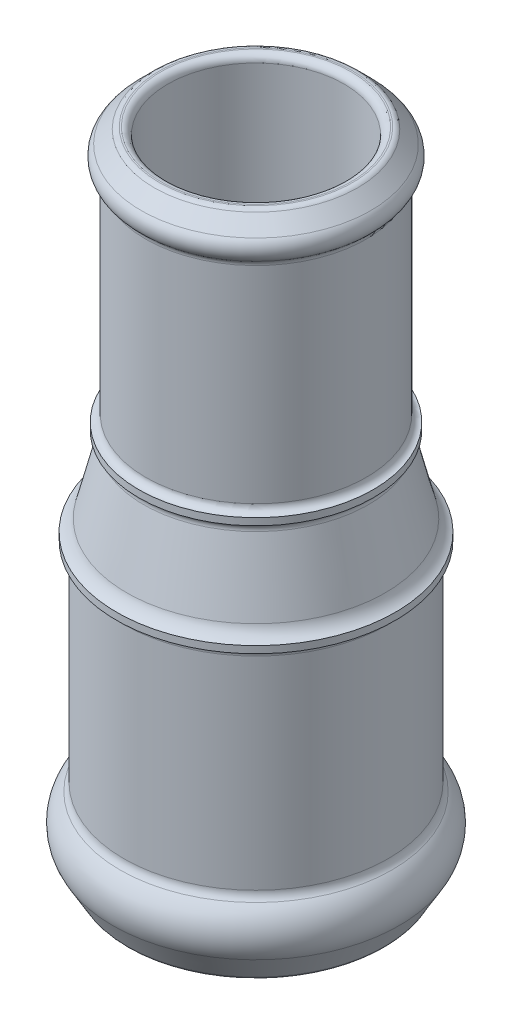
ISO-10303-21;
HEADER;
FILE_DESCRIPTION(('STEP AP214'),'2;1');
FILE_NAME('part.step','',(''),(''),'','','');
FILE_SCHEMA(('AUTOMOTIVE_DESIGN { 1 0 10303 214 1 1 1 1 }'));
ENDSEC;
DATA;
#1=APPLICATION_CONTEXT('core data for automotive mechanical design processes');
#2=APPLICATION_PROTOCOL_DEFINITION('international standard','automotive_design',2000,#1);
#3=PRODUCT_CONTEXT('',#1,'mechanical');
#4=PRODUCT('Part','Part','',(#3));
#5=PRODUCT_RELATED_PRODUCT_CATEGORY('part','',(#4));
#6=PRODUCT_DEFINITION_FORMATION('','',#4);
#7=PRODUCT_DEFINITION_CONTEXT('part definition',#1,'design');
#8=PRODUCT_DEFINITION('design','',#6,#7);
#9=PRODUCT_DEFINITION_SHAPE('','',#8);
#10=(LENGTH_UNIT() NAMED_UNIT(*) SI_UNIT(.MILLI.,.METRE.));
#11=(NAMED_UNIT(*) PLANE_ANGLE_UNIT() SI_UNIT($,.RADIAN.));
#12=(NAMED_UNIT(*) SI_UNIT($,.STERADIAN.) SOLID_ANGLE_UNIT());
#13=UNCERTAINTY_MEASURE_WITH_UNIT(LENGTH_MEASURE(1.E-05),#10,'distance_accuracy_value','');
#14=(GEOMETRIC_REPRESENTATION_CONTEXT(3) GLOBAL_UNCERTAINTY_ASSIGNED_CONTEXT((#13)) GLOBAL_UNIT_ASSIGNED_CONTEXT((#10,
#11,#12)) REPRESENTATION_CONTEXT('',''));
#15=CARTESIAN_POINT('',(0.,0.,0.));
#16=DIRECTION('',(0.,0.,1.));
#17=DIRECTION('',(1.,0.,0.));
#18=AXIS2_PLACEMENT_3D('',#15,#16,#17);
#19=CARTESIAN_POINT('',(0.,0.,0.));
#20=DIRECTION('',(0.,-1.,0.));
#21=DIRECTION('',(0.,0.,-1.));
#22=AXIS2_PLACEMENT_3D('',#19,#20,#21);
#23=CYLINDRICAL_SURFACE('',#22,8.4455);
#24=CARTESIAN_POINT('',(0.,28.321,0.));
#25=DIRECTION('',(0.,-1.,0.));
#26=DIRECTION('',(0.,0.,-1.));
#27=AXIS2_PLACEMENT_3D('',#24,#25,#26);
#28=CIRCLE('',#27,8.4455);
#29=CARTESIAN_POINT('',(0.,28.321,-8.4455));
#30=VERTEX_POINT('',#29);
#31=EDGE_CURVE('E137',#30,#30,#28,.T.);
#32=ORIENTED_EDGE('',*,*,#31,.T.);
#33=EDGE_LOOP('',(#32));
#34=FACE_BOUND('',#33,.T.);
#35=CARTESIAN_POINT('',(0.,27.813,0.));
#36=DIRECTION('',(0.,-1.,0.));
#37=DIRECTION('',(0.,0.,-1.));
#38=AXIS2_PLACEMENT_3D('',#35,#36,#37);
#39=CIRCLE('',#38,8.4455);
#40=CARTESIAN_POINT('',(0.,27.813,-8.4455));
#41=VERTEX_POINT('',#40);
#42=EDGE_CURVE('E141',#41,#41,#39,.T.);
#43=ORIENTED_EDGE('',*,*,#42,.F.);
#44=EDGE_LOOP('',(#43));
#45=FACE_BOUND('',#44,.T.);
#46=ADVANCED_FACE('F41',(#34,#45),#23,.T.);
#47=CARTESIAN_POINT('',(0.,21.463,0.));
#48=DIRECTION('',(0.,-1.,0.));
#49=DIRECTION('',(0.,0.,-1.));
#50=AXIS2_PLACEMENT_3D('',#47,#48,#49);
#51=CONICAL_SURFACE('',#50,9.525,0.244978663126864);
#52=CARTESIAN_POINT('',(0.,22.317925733049,0.));
#53=DIRECTION('',(0.,-1.,0.));
#54=DIRECTION('',(0.,0.,-1.));
#55=AXIS2_PLACEMENT_3D('',#52,#53,#54);
#56=CIRCLE('',#55,9.31126856673774);
#57=CARTESIAN_POINT('',(0.,22.317925733049,-9.31126856673774));
#58=VERTEX_POINT('',#57);
#59=EDGE_CURVE('E81',#58,#58,#56,.F.);
#60=ORIENTED_EDGE('',*,*,#59,.T.);
#61=EDGE_LOOP('',(#60));
#62=FACE_BOUND('',#61,.T.);
#63=CARTESIAN_POINT('',(0.,27.2008579198598,0.));
#64=DIRECTION('',(0.,-1.,0.));
#65=DIRECTION('',(0.,0.,-1.));
#66=AXIS2_PLACEMENT_3D('',#63,#64,#65);
#67=CIRCLE('',#66,8.09053552003505);
#68=CARTESIAN_POINT('',(0.,27.2008579198598,-8.09053552003505));
#69=VERTEX_POINT('',#68);
#70=EDGE_CURVE('E93',#69,#69,#67,.T.);
#71=ORIENTED_EDGE('',*,*,#70,.T.);
#72=EDGE_LOOP('',(#71));
#73=FACE_BOUND('',#72,.T.);
#74=ADVANCED_FACE('F161',(#62,#73),#51,.T.);
#75=CARTESIAN_POINT('',(0.,0.,0.));
#76=DIRECTION('',(0.,-1.,0.));
#77=DIRECTION('',(0.,0.,-1.));
#78=AXIS2_PLACEMENT_3D('',#75,#76,#77);
#79=CYLINDRICAL_SURFACE('',#78,10.033);
#80=CARTESIAN_POINT('',(0.,20.955,0.));
#81=DIRECTION('',(0.,-1.,0.));
#82=DIRECTION('',(0.,0.,-1.));
#83=AXIS2_PLACEMENT_3D('',#80,#81,#82);
#84=CIRCLE('',#83,10.033);
#85=CARTESIAN_POINT('',(0.,20.955,-10.033));
#86=VERTEX_POINT('',#85);
#87=EDGE_CURVE('E149',#86,#86,#84,.T.);
#88=ORIENTED_EDGE('',*,*,#87,.F.);
#89=EDGE_LOOP('',(#88));
#90=FACE_BOUND('',#89,.T.);
#91=CARTESIAN_POINT('',(0.,21.463,0.));
#92=DIRECTION('',(0.,-1.,0.));
#93=DIRECTION('',(0.,0.,-1.));
#94=AXIS2_PLACEMENT_3D('',#91,#92,#93);
#95=CIRCLE('',#94,10.033);
#96=CARTESIAN_POINT('',(0.,21.463,-10.033));
#97=VERTEX_POINT('',#96);
#98=EDGE_CURVE('E145',#97,#97,#95,.T.);
#99=ORIENTED_EDGE('',*,*,#98,.T.);
#100=EDGE_LOOP('',(#99));
#101=FACE_BOUND('',#100,.T.);
#102=ADVANCED_FACE('F157',(#90,#101),#79,.T.);
#103=CARTESIAN_POINT('',(0.,0.,0.));
#104=DIRECTION('',(0.,-1.,0.));
#105=DIRECTION('',(0.,0.,-1.));
#106=AXIS2_PLACEMENT_3D('',#103,#104,#105);
#107=CYLINDRICAL_SURFACE('',#106,9.525);
#108=CARTESIAN_POINT('',(0.,20.447,0.));
#109=DIRECTION('',(0.,1.,0.));
#110=DIRECTION('',(0.,0.,1.));
#111=AXIS2_PLACEMENT_3D('',#108,#109,#110);
#112=CIRCLE('',#111,9.525);
#113=CARTESIAN_POINT('',(0.,20.447,9.525));
#114=VERTEX_POINT('',#113);
#115=EDGE_CURVE('E85',#114,#114,#112,.F.);
#116=ORIENTED_EDGE('',*,*,#115,.T.);
#117=EDGE_LOOP('',(#116));
#118=FACE_BOUND('',#117,.T.);
#119=CARTESIAN_POINT('',(0.,5.842,0.));
#120=DIRECTION('',(0.,-1.,0.));
#121=DIRECTION('',(0.,0.,-1.));
#122=AXIS2_PLACEMENT_3D('',#119,#120,#121);
#123=CIRCLE('',#122,9.525);
#124=CARTESIAN_POINT('',(0.,5.842,-9.525));
#125=VERTEX_POINT('',#124);
#126=EDGE_CURVE('E117',#125,#125,#123,.F.);
#127=ORIENTED_EDGE('',*,*,#126,.T.);
#128=EDGE_LOOP('',(#127));
#129=FACE_BOUND('',#128,.T.);
#130=ADVANCED_FACE('F160',(#118,#129),#107,.T.);
#131=CARTESIAN_POINT('',(0.,0.,0.));
#132=DIRECTION('',(0.,1.,0.));
#133=DIRECTION('',(0.,0.,1.));
#134=AXIS2_PLACEMENT_3D('',#131,#132,#133);
#135=PLANE('',#134);
#136=CARTESIAN_POINT('',(0.,0.,0.));
#137=DIRECTION('',(0.,1.,0.));
#138=DIRECTION('',(0.,0.,1.));
#139=AXIS2_PLACEMENT_3D('',#136,#137,#138);
#140=CIRCLE('',#139,8.83876669576836);
#141=CARTESIAN_POINT('',(0.,0.,8.83876669576836));
#142=VERTEX_POINT('',#141);
#143=EDGE_CURVE('E73',#142,#142,#140,.F.);
#144=ORIENTED_EDGE('',*,*,#143,.T.);
#145=EDGE_LOOP('',(#144));
#146=FACE_BOUND('',#145,.T.);
#147=CARTESIAN_POINT('',(0.,0.,0.));
#148=DIRECTION('',(0.,1.,0.));
#149=DIRECTION('',(0.,0.,1.));
#150=AXIS2_PLACEMENT_3D('',#147,#148,#149);
#151=CIRCLE('',#150,8.4455);
#152=CARTESIAN_POINT('',(0.,0.,8.4455));
#153=VERTEX_POINT('',#152);
#154=EDGE_CURVE('E77',#153,#153,#151,.T.);
#155=ORIENTED_EDGE('',*,*,#154,.T.);
#156=EDGE_LOOP('',(#155));
#157=FACE_BOUND('',#156,.T.);
#158=ADVANCED_FACE('F262',(#146,#157),#135,.F.);
#159=CARTESIAN_POINT('',(0.,0.,0.));
#160=DIRECTION('',(0.,-1.,0.));
#161=DIRECTION('',(0.,0.,-1.));
#162=AXIS2_PLACEMENT_3D('',#159,#160,#161);
#163=CYLINDRICAL_SURFACE('',#162,7.9375);
#164=CARTESIAN_POINT('',(0.,0.507999999999999,0.));
#165=DIRECTION('',(0.,1.,0.));
#166=DIRECTION('',(0.,0.,1.));
#167=AXIS2_PLACEMENT_3D('',#164,#165,#166);
#168=CIRCLE('',#167,7.9375);
#169=CARTESIAN_POINT('',(0.,0.507999999999999,7.9375));
#170=VERTEX_POINT('',#169);
#171=EDGE_CURVE('E65',#170,#170,#168,.F.);
#172=ORIENTED_EDGE('',*,*,#171,.T.);
#173=EDGE_LOOP('',(#172));
#174=FACE_BOUND('',#173,.T.);
#175=CARTESIAN_POINT('',(0.,20.8376234218623,0.));
#176=DIRECTION('',(0.,-1.,0.));
#177=DIRECTION('',(0.,0.,-1.));
#178=AXIS2_PLACEMENT_3D('',#175,#176,#177);
#179=CIRCLE('',#178,7.9375);
#180=CARTESIAN_POINT('',(0.,20.8376234218623,-7.9375));
#181=VERTEX_POINT('',#180);
#182=EDGE_CURVE('E125',#181,#181,#179,.F.);
#183=ORIENTED_EDGE('',*,*,#182,.T.);
#184=EDGE_LOOP('',(#183));
#185=FACE_BOUND('',#184,.T.);
#186=ADVANCED_FACE('F258',(#174,#185),#163,.F.);
#187=CARTESIAN_POINT('',(0.,21.463,0.));
#188=DIRECTION('',(0.,-1.,0.));
#189=DIRECTION('',(0.,0.,-1.));
#190=AXIS2_PLACEMENT_3D('',#187,#188,#189);
#191=CONICAL_SURFACE('',#190,7.9375,0.244978663126864);
#192=CARTESIAN_POINT('',(0.,22.0697043970468,0.));
#193=DIRECTION('',(0.,-1.,0.));
#194=DIRECTION('',(0.,0.,-1.));
#195=AXIS2_PLACEMENT_3D('',#192,#193,#194);
#196=CIRCLE('',#195,7.78582390073829);
#197=CARTESIAN_POINT('',(0.,22.0697043970468,-7.78582390073829));
#198=VERTEX_POINT('',#197);
#199=EDGE_CURVE('E129',#198,#198,#196,.T.);
#200=ORIENTED_EDGE('',*,*,#199,.T.);
#201=EDGE_LOOP('',(#200));
#202=FACE_BOUND('',#201,.T.);
#203=CARTESIAN_POINT('',(0.,27.2062956029531,0.));
#204=DIRECTION('',(0.,1.,0.));
#205=DIRECTION('',(0.,0.,1.));
#206=AXIS2_PLACEMENT_3D('',#203,#204,#205);
#207=CIRCLE('',#206,6.50167609926172);
#208=CARTESIAN_POINT('',(0.,27.2062956029531,6.50167609926172));
#209=VERTEX_POINT('',#208);
#210=EDGE_CURVE('E133',#209,#209,#207,.T.);
#211=ORIENTED_EDGE('',*,*,#210,.T.);
#212=EDGE_LOOP('',(#211));
#213=FACE_BOUND('',#212,.T.);
#214=ADVANCED_FACE('F255',(#202,#213),#191,.F.);
#215=CARTESIAN_POINT('',(0.,0.,0.));
#216=DIRECTION('',(0.,-1.,0.));
#217=DIRECTION('',(0.,0.,-1.));
#218=AXIS2_PLACEMENT_3D('',#215,#216,#217);
#219=CYLINDRICAL_SURFACE('',#218,6.35);
#220=CARTESIAN_POINT('',(0.,46.228,0.));
#221=DIRECTION('',(0.,1.,0.));
#222=DIRECTION('',(0.,0.,1.));
#223=AXIS2_PLACEMENT_3D('',#220,#221,#222);
#224=CIRCLE('',#223,6.35);
#225=CARTESIAN_POINT('',(0.,46.228,6.35));
#226=VERTEX_POINT('',#225);
#227=EDGE_CURVE('E10',#226,#226,#224,.T.);
#228=ORIENTED_EDGE('',*,*,#227,.T.);
#229=EDGE_LOOP('',(#228));
#230=FACE_BOUND('',#229,.T.);
#231=CARTESIAN_POINT('',(0.,28.4383765781377,0.));
#232=DIRECTION('',(0.,1.,0.));
#233=DIRECTION('',(0.,0.,1.));
#234=AXIS2_PLACEMENT_3D('',#231,#232,#233);
#235=CIRCLE('',#234,6.35);
#236=CARTESIAN_POINT('',(0.,28.4383765781377,6.35));
#237=VERTEX_POINT('',#236);
#238=EDGE_CURVE('E121',#237,#237,#235,.F.);
#239=ORIENTED_EDGE('',*,*,#238,.T.);
#240=EDGE_LOOP('',(#239));
#241=FACE_BOUND('',#240,.T.);
#242=ADVANCED_FACE('F249',(#230,#241),#219,.F.);
#243=CARTESIAN_POINT('',(0.,46.736,0.));
#244=DIRECTION('',(0.,1.,0.));
#245=DIRECTION('',(0.,0.,1.));
#246=AXIS2_PLACEMENT_3D('',#243,#244,#245);
#247=PLANE('',#246);
#248=CARTESIAN_POINT('',(0.,46.736,0.));
#249=DIRECTION('',(0.,1.,0.));
#250=DIRECTION('',(0.,0.,1.));
#251=AXIS2_PLACEMENT_3D('',#248,#249,#250);
#252=CIRCLE('',#251,6.96507951031445);
#253=CARTESIAN_POINT('',(0.,46.736,6.96507951031445));
#254=VERTEX_POINT('',#253);
#255=EDGE_CURVE('E54',#254,#254,#252,.T.);
#256=ORIENTED_EDGE('',*,*,#255,.T.);
#257=EDGE_LOOP('',(#256));
#258=FACE_BOUND('',#257,.T.);
#259=CARTESIAN_POINT('',(0.,46.736,0.));
#260=DIRECTION('',(0.,1.,0.));
#261=DIRECTION('',(0.,0.,1.));
#262=AXIS2_PLACEMENT_3D('',#259,#260,#261);
#263=CIRCLE('',#262,6.858);
#264=CARTESIAN_POINT('',(0.,46.736,6.858));
#265=VERTEX_POINT('',#264);
#266=EDGE_CURVE('E59',#265,#265,#263,.F.);
#267=ORIENTED_EDGE('',*,*,#266,.T.);
#268=EDGE_LOOP('',(#267));
#269=FACE_BOUND('',#268,.T.);
#270=ADVANCED_FACE('F242',(#258,#269),#247,.T.);
#271=CARTESIAN_POINT('',(0.,0.,0.));
#272=DIRECTION('',(0.,-1.,0.));
#273=DIRECTION('',(0.,0.,-1.));
#274=AXIS2_PLACEMENT_3D('',#271,#272,#273);
#275=CYLINDRICAL_SURFACE('',#274,7.9375);
#276=CARTESIAN_POINT('',(0.,28.829,0.));
#277=DIRECTION('',(0.,1.,0.));
#278=DIRECTION('',(0.,0.,1.));
#279=AXIS2_PLACEMENT_3D('',#276,#277,#278);
#280=CIRCLE('',#279,7.9375);
#281=CARTESIAN_POINT('',(0.,28.829,7.9375));
#282=VERTEX_POINT('',#281);
#283=EDGE_CURVE('E89',#282,#282,#280,.T.);
#284=ORIENTED_EDGE('',*,*,#283,.T.);
#285=EDGE_LOOP('',(#284));
#286=FACE_BOUND('',#285,.T.);
#287=CARTESIAN_POINT('',(0.,43.688,0.));
#288=DIRECTION('',(0.,-1.,0.));
#289=DIRECTION('',(0.,0.,-1.));
#290=AXIS2_PLACEMENT_3D('',#287,#288,#289);
#291=CIRCLE('',#290,7.9375);
#292=CARTESIAN_POINT('',(0.,43.688,-7.9375));
#293=VERTEX_POINT('',#292);
#294=EDGE_CURVE('E105',#293,#293,#291,.T.);
#295=ORIENTED_EDGE('',*,*,#294,.T.);
#296=EDGE_LOOP('',(#295));
#297=FACE_BOUND('',#296,.T.);
#298=ADVANCED_FACE('F194',(#286,#297),#275,.T.);
#299=CARTESIAN_POINT('',(0.,20.8376234218623,0.));
#300=DIRECTION('',(0.,-1.,0.));
#301=DIRECTION('',(0.,0.,-1.));
#302=AXIS2_PLACEMENT_3D('',#299,#300,#301);
#303=DEGENERATE_TOROIDAL_SURFACE('',#302,2.8575,5.08,.T.);
#304=ORIENTED_EDGE('',*,*,#182,.F.);
#305=EDGE_LOOP('',(#304));
#306=FACE_BOUND('',#305,.T.);
#307=ORIENTED_EDGE('',*,*,#199,.F.);
#308=EDGE_LOOP('',(#307));
#309=FACE_BOUND('',#308,.T.);
#310=ADVANCED_FACE('F190',(#306,#309),#303,.F.);
#311=CARTESIAN_POINT('',(0.,28.4383765781377,0.));
#312=DIRECTION('',(0.,1.,0.));
#313=DIRECTION('',(0.,0.,1.));
#314=AXIS2_PLACEMENT_3D('',#311,#312,#313);
#315=TOROIDAL_SURFACE('',#314,11.43,5.08);
#316=ORIENTED_EDGE('',*,*,#210,.F.);
#317=EDGE_LOOP('',(#316));
#318=FACE_BOUND('',#317,.T.);
#319=ORIENTED_EDGE('',*,*,#238,.F.);
#320=EDGE_LOOP('',(#319));
#321=FACE_BOUND('',#320,.T.);
#322=ADVANCED_FACE('F193',(#318,#321),#315,.T.);
#323=CARTESIAN_POINT('',(0.,0.,0.));
#324=DIRECTION('',(0.,1.,0.));
#325=DIRECTION('',(0.,0.,1.));
#326=AXIS2_PLACEMENT_3D('',#323,#324,#325);
#327=CONICAL_SURFACE('',#326,9.13206063251669,0.523598775598296);
#328=CARTESIAN_POINT('',(0.,0.254,0.));
#329=DIRECTION('',(0.,1.,0.));
#330=DIRECTION('',(0.,0.,1.));
#331=AXIS2_PLACEMENT_3D('',#328,#329,#330);
#332=CIRCLE('',#331,9.27870760089085);
#333=CARTESIAN_POINT('',(0.,0.254,9.27870760089085));
#334=VERTEX_POINT('',#333);
#335=EDGE_CURVE('E69',#334,#334,#332,.T.);
#336=CARTESIAN_POINT('',(0.,2.07271748486344,0.));
#337=DIRECTION('',(0.,1.,0.));
#338=DIRECTION('',(0.,0.,1.));
#339=AXIS2_PLACEMENT_3D('',#336,#337,#338);
#340=CIRCLE('',#339,10.3287446303566);
#341=CARTESIAN_POINT('',(0.,2.07271748486344,10.3287446303566));
#342=VERTEX_POINT('',#341);
#343=EDGE_CURVE('E113',#342,#342,#340,.F.);
#344=CARTESIAN_POINT('',(0.,0.254,9.27870760089085));
#345=CARTESIAN_POINT('',(0.,0.272944973800661,9.28964548661445));
#346=CARTESIAN_POINT('',(0.,0.291889947601322,9.30058337233806));
#347=CARTESIAN_POINT('',(0.,0.329779895202643,9.32245914378526));
#348=CARTESIAN_POINT('',(0.,0.348724869003304,9.33339702950886));
#349=CARTESIAN_POINT('',(0.,0.386614816604625,9.35527280095607));
#350=CARTESIAN_POINT('',(0.,0.405559790405286,9.36621068667967));
#351=CARTESIAN_POINT('',(0.,0.443449738006608,9.38808645812687));
#352=CARTESIAN_POINT('',(0.,0.462394711807269,9.39902434385047));
#353=CARTESIAN_POINT('',(0.,0.50028465940859,9.42090011529768));
#354=CARTESIAN_POINT('',(0.,0.519229633209251,9.43183800102128));
#355=CARTESIAN_POINT('',(0.,0.557119580810573,9.45371377246848));
#356=CARTESIAN_POINT('',(0.,0.576064554611234,9.46465165819209));
#357=CARTESIAN_POINT('',(0.,0.613954502212555,9.48652742963929));
#358=CARTESIAN_POINT('',(0.,0.632899476013216,9.49746531536289));
#359=CARTESIAN_POINT('',(0.,0.670789423614537,9.51934108681009));
#360=CARTESIAN_POINT('',(0.,0.689734397415198,9.5302789725337));
#361=CARTESIAN_POINT('',(0.,0.72762434501652,9.5521547439809));
#362=CARTESIAN_POINT('',(0.,0.746569318817181,9.5630926297045));
#363=CARTESIAN_POINT('',(0.,0.784459266418502,9.58496840115171));
#364=CARTESIAN_POINT('',(0.,0.803404240219163,9.59590628687531));
#365=CARTESIAN_POINT('',(0.,0.841294187820485,9.61778205832251));
#366=CARTESIAN_POINT('',(0.,0.860239161621146,9.62871994404611));
#367=CARTESIAN_POINT('',(0.,0.898129109222467,9.65059571549332));
#368=CARTESIAN_POINT('',(0.,0.917074083023128,9.66153360121692));
#369=CARTESIAN_POINT('',(0.,0.95496403062445,9.68340937266412));
#370=CARTESIAN_POINT('',(0.,0.973909004425111,9.69434725838773));
#371=CARTESIAN_POINT('',(0.,1.01179895202643,9.71622302983493));
#372=CARTESIAN_POINT('',(0.,1.03074392582709,9.72716091555853));
#373=CARTESIAN_POINT('',(0.,1.06863387342841,9.74903668700573));
#374=CARTESIAN_POINT('',(0.,1.08757884722908,9.75997457272934));
#375=CARTESIAN_POINT('',(0.,1.1254687948304,9.78185034417654));
#376=CARTESIAN_POINT('',(0.,1.14441376863106,9.79278822990014));
#377=CARTESIAN_POINT('',(0.,1.18230371623238,9.81466400134734));
#378=CARTESIAN_POINT('',(0.,1.20124869003304,9.82560188707095));
#379=CARTESIAN_POINT('',(0.,1.23913863763436,9.84747765851815));
#380=CARTESIAN_POINT('',(0.,1.25808361143502,9.85841554424175));
#381=CARTESIAN_POINT('',(0.,1.29597355903634,9.88029131568896));
#382=CARTESIAN_POINT('',(0.,1.31491853283701,9.89122920141256));
#383=CARTESIAN_POINT('',(0.,1.35280848043833,9.91310497285976));
#384=CARTESIAN_POINT('',(0.,1.37175345423899,9.92404285858336));
#385=CARTESIAN_POINT('',(0.,1.40964340184031,9.94591863003057));
#386=CARTESIAN_POINT('',(0.,1.42858837564097,9.95685651575417));
#387=CARTESIAN_POINT('',(0.,1.46647832324229,9.97873228720137));
#388=CARTESIAN_POINT('',(0.,1.48542329704295,9.98967017292498));
#389=CARTESIAN_POINT('',(0.,1.52331324464427,10.0115459443722));
#390=CARTESIAN_POINT('',(0.,1.54225821844493,10.0224838300958));
#391=CARTESIAN_POINT('',(0.,1.58014816604626,10.044359601543));
#392=CARTESIAN_POINT('',(0.,1.59909313984692,10.0552974872666));
#393=CARTESIAN_POINT('',(0.,1.63698308744824,10.0771732587138));
#394=CARTESIAN_POINT('',(0.,1.6559280612489,10.0881111444374));
#395=CARTESIAN_POINT('',(0.,1.69381800885022,10.1099869158846));
#396=CARTESIAN_POINT('',(0.,1.71276298265088,10.1209248016082));
#397=CARTESIAN_POINT('',(0.,1.7506529302522,10.1428005730554));
#398=CARTESIAN_POINT('',(0.,1.76959790405286,10.153738458779));
#399=CARTESIAN_POINT('',(0.,1.80748785165419,10.1756142302262));
#400=CARTESIAN_POINT('',(0.,1.82643282545485,10.1865521159498));
#401=CARTESIAN_POINT('',(0.,1.86432277305617,10.208427887397));
#402=CARTESIAN_POINT('',(0.,1.88326774685683,10.2193657731206));
#403=CARTESIAN_POINT('',(0.,1.92115769445815,10.2412415445678));
#404=CARTESIAN_POINT('',(0.,1.94010266825881,10.2521794302914));
#405=CARTESIAN_POINT('',(0.,1.97799261586013,10.2740552017386));
#406=CARTESIAN_POINT('',(0.,1.99693758966079,10.2849930874622));
#407=CARTESIAN_POINT('',(0.,2.03482753726212,10.3068688589094));
#408=CARTESIAN_POINT('',(0.,2.05377251106278,10.317806744633));
#409=CARTESIAN_POINT('',(0.,2.07271748486344,10.3287446303566));
#410=B_SPLINE_CURVE_WITH_KNOTS('',3,(#344,#345,#346,#347,#348,#349,#350,#351,#352,#353,#354,
#355,#356,#357,#358,#359,#360,#361,#362,#363,#364,#365,#366,#367,#368,#369,#370,#371,#372,#373,
#374,#375,#376,#377,#378,#379,#380,#381,#382,#383,#384,#385,#386,#387,#388,#389,#390,#391,#392,
#393,#394,#395,#396,#397,#398,#399,#400,#401,#402,#403,#404,#405,#406,#407,#408,#409),
.UNSPECIFIED.,.F.,.F.,(4,2,2,2,2,2,2,2,2,2,2,2,2,2,2,2,2,2,2,2,2,2,2,2,2,2,2,2,2,2,2,2,4),(0.,
0.0656273143416113,0.131254628683223,0.196881943024835,0.262509257366446,0.328136571708057,
0.393763886049668,0.459391200391281,0.525018514732892,0.590645829074503,0.656273143416114,
0.721900457757726,0.787527772099338,0.853155086440949,0.91878240078256,0.984409715124172,
1.05003702946578,1.11566434380739,1.18129165814901,1.24691897249062,1.31254628683223,
1.37817360117384,1.44380091551545,1.50942822985706,1.57505554419867,1.64068285854029,
1.7063101728819,1.77193748722351,1.83756480156512,1.90319211590673,1.96881943024834,
2.03444674458996,2.10007405893157),.UNSPECIFIED.);
#411=EDGE_CURVE('BSEAM198',#334,#342,#410,.T.);
#412=ORIENTED_EDGE('',*,*,#335,.T.);
#413=ORIENTED_EDGE('',*,*,#343,.T.);
#414=ORIENTED_EDGE('',*,*,#411,.T.);
#415=ORIENTED_EDGE('',*,*,#411,.F.);
#416=EDGE_LOOP('',(#412,#414,#413,#415));
#417=FACE_BOUND('',#416,.T.);
#418=ADVANCED_FACE('F198',(#417),#327,.T.);
#419=CARTESIAN_POINT('',(0.,5.842,0.));
#420=DIRECTION('',(0.,-1.,0.));
#421=DIRECTION('',(0.,0.,-1.));
#422=AXIS2_PLACEMENT_3D('',#419,#420,#421);
#423=TOROIDAL_SURFACE('',#422,10.287,0.762);
#424=CARTESIAN_POINT('',(0.,5.26524249650693,0.));
#425=DIRECTION('',(0.,1.,0.));
#426=DIRECTION('',(0.,0.,1.));
#427=AXIS2_PLACEMENT_3D('',#424,#425,#426);
#428=CIRCLE('',#427,9.78900925494094);
#429=CARTESIAN_POINT('',(0.,5.26524249650693,9.78900925494094));
#430=VERTEX_POINT('',#429);
#431=EDGE_CURVE('E109',#430,#430,#428,.T.);
#432=ORIENTED_EDGE('',*,*,#431,.T.);
#433=EDGE_LOOP('',(#432));
#434=FACE_BOUND('',#433,.T.);
#435=ORIENTED_EDGE('',*,*,#126,.F.);
#436=EDGE_LOOP('',(#435));
#437=FACE_BOUND('',#436,.T.);
#438=ADVANCED_FACE('F206',(#434,#437),#423,.F.);
#439=CARTESIAN_POINT('',(0.,3.34271748486343,0.));
#440=DIRECTION('',(0.,1.,0.));
#441=DIRECTION('',(0.,0.,1.));
#442=AXIS2_PLACEMENT_3D('',#439,#440,#441);
#443=TOROIDAL_SURFACE('',#442,8.12904010474415,2.54);
#444=ORIENTED_EDGE('',*,*,#431,.F.);
#445=EDGE_LOOP('',(#444));
#446=FACE_BOUND('',#445,.T.);
#447=ORIENTED_EDGE('',*,*,#343,.F.);
#448=EDGE_LOOP('',(#447));
#449=FACE_BOUND('',#448,.T.);
#450=ADVANCED_FACE('F210',(#446,#449),#443,.T.);
#451=CARTESIAN_POINT('',(0.,44.196,0.));
#452=DIRECTION('',(0.,-1.,0.));
#453=DIRECTION('',(0.,0.,-1.));
#454=AXIS2_PLACEMENT_3D('',#451,#452,#453);
#455=CONICAL_SURFACE('',#454,9.7155,0.785398163397451);
#456=CARTESIAN_POINT('',(0.,46.5872102448428,0.));
#457=DIRECTION('',(0.,1.,0.));
#458=DIRECTION('',(0.,0.,1.));
#459=AXIS2_PLACEMENT_3D('',#456,#457,#458);
#460=CIRCLE('',#459,7.32428975515721);
#461=CARTESIAN_POINT('',(0.,46.5872102448428,7.32428975515721));
#462=VERTEX_POINT('',#461);
#463=EDGE_CURVE('E49',#462,#462,#460,.F.);
#464=ORIENTED_EDGE('',*,*,#463,.T.);
#465=EDGE_LOOP('',(#464));
#466=FACE_BOUND('',#465,.T.);
#467=CARTESIAN_POINT('',(0.,45.6410444683663,0.));
#468=DIRECTION('',(0.,-1.,0.));
#469=DIRECTION('',(0.,0.,-1.));
#470=AXIS2_PLACEMENT_3D('',#467,#468,#469);
#471=CIRCLE('',#470,8.27045553163371);
#472=CARTESIAN_POINT('',(0.,45.6410444683663,-8.27045553163371));
#473=VERTEX_POINT('',#472);
#474=EDGE_CURVE('E97',#473,#473,#471,.F.);
#475=ORIENTED_EDGE('',*,*,#474,.T.);
#476=EDGE_LOOP('',(#475));
#477=FACE_BOUND('',#476,.T.);
#478=ADVANCED_FACE('F214',(#466,#477),#455,.T.);
#479=CARTESIAN_POINT('',(0.,43.688,0.));
#480=DIRECTION('',(0.,-1.,0.));
#481=DIRECTION('',(0.,0.,-1.));
#482=AXIS2_PLACEMENT_3D('',#479,#480,#481);
#483=TOROIDAL_SURFACE('',#482,8.4455,0.508);
#484=CARTESIAN_POINT('',(0.,44.0995413262269,0.));
#485=DIRECTION('',(0.,-1.,0.));
#486=DIRECTION('',(0.,0.,-1.));
#487=AXIS2_PLACEMENT_3D('',#484,#485,#486);
#488=CIRCLE('',#487,8.14767834731608);
#489=CARTESIAN_POINT('',(0.,44.0995413262269,-8.14767834731608));
#490=VERTEX_POINT('',#489);
#491=EDGE_CURVE('E101',#490,#490,#488,.T.);
#492=ORIENTED_EDGE('',*,*,#491,.T.);
#493=EDGE_LOOP('',(#492));
#494=FACE_BOUND('',#493,.T.);
#495=ORIENTED_EDGE('',*,*,#294,.F.);
#496=EDGE_LOOP('',(#495));
#497=FACE_BOUND('',#496,.T.);
#498=ADVANCED_FACE('F220',(#494,#497),#483,.F.);
#499=CARTESIAN_POINT('',(0.,44.9226239786807,0.));
#500=DIRECTION('',(0.,1.,0.));
#501=DIRECTION('',(0.,0.,1.));
#502=AXIS2_PLACEMENT_3D('',#499,#500,#501);
#503=TOROIDAL_SURFACE('',#502,7.55203504194818,1.016);
#504=ORIENTED_EDGE('',*,*,#474,.F.);
#505=EDGE_LOOP('',(#504));
#506=FACE_BOUND('',#505,.T.);
#507=ORIENTED_EDGE('',*,*,#491,.F.);
#508=EDGE_LOOP('',(#507));
#509=FACE_BOUND('',#508,.T.);
#510=ADVANCED_FACE('F223',(#506,#509),#503,.T.);
#511=CARTESIAN_POINT('',(0.,27.3240660173783,0.));
#512=DIRECTION('',(0.,1.,0.));
#513=DIRECTION('',(0.,0.,1.));
#514=AXIS2_PLACEMENT_3D('',#511,#512,#513);
#515=TOROIDAL_SURFACE('',#514,8.58336791010888,0.508);
#516=ORIENTED_EDGE('',*,*,#42,.T.);
#517=EDGE_LOOP('',(#516));
#518=FACE_BOUND('',#517,.T.);
#519=ORIENTED_EDGE('',*,*,#70,.F.);
#520=EDGE_LOOP('',(#519));
#521=FACE_BOUND('',#520,.T.);
#522=ADVANCED_FACE('F227',(#518,#521),#515,.F.);
#523=CARTESIAN_POINT('',(0.,28.829,0.));
#524=DIRECTION('',(0.,1.,0.));
#525=DIRECTION('',(0.,0.,1.));
#526=AXIS2_PLACEMENT_3D('',#523,#524,#525);
#527=TOROIDAL_SURFACE('',#526,8.4455,0.508);
#528=ORIENTED_EDGE('',*,*,#283,.F.);
#529=EDGE_LOOP('',(#528));
#530=FACE_BOUND('',#529,.T.);
#531=ORIENTED_EDGE('',*,*,#31,.F.);
#532=EDGE_LOOP('',(#531));
#533=FACE_BOUND('',#532,.T.);
#534=ADVANCED_FACE('F177',(#530,#533),#527,.F.);
#535=CARTESIAN_POINT('',(0.,20.447,0.));
#536=DIRECTION('',(0.,1.,0.));
#537=DIRECTION('',(0.,0.,1.));
#538=AXIS2_PLACEMENT_3D('',#535,#536,#537);
#539=TOROIDAL_SURFACE('',#538,10.033,0.508);
#540=ORIENTED_EDGE('',*,*,#87,.T.);
#541=EDGE_LOOP('',(#540));
#542=FACE_BOUND('',#541,.T.);
#543=ORIENTED_EDGE('',*,*,#115,.F.);
#544=EDGE_LOOP('',(#543));
#545=FACE_BOUND('',#544,.T.);
#546=ADVANCED_FACE('F154',(#542,#545),#539,.F.);
#547=CARTESIAN_POINT('',(0.,22.6259459768452,0.));
#548=DIRECTION('',(0.,-1.,0.));
#549=DIRECTION('',(0.,0.,-1.));
#550=AXIS2_PLACEMENT_3D('',#547,#548,#549);
#551=TOROIDAL_SURFACE('',#550,10.5433495419223,1.27);
#552=ORIENTED_EDGE('',*,*,#59,.F.);
#553=EDGE_LOOP('',(#552));
#554=FACE_BOUND('',#553,.T.);
#555=ORIENTED_EDGE('',*,*,#98,.F.);
#556=EDGE_LOOP('',(#555));
#557=FACE_BOUND('',#556,.T.);
#558=ADVANCED_FACE('F165',(#554,#557),#551,.F.);
#559=CARTESIAN_POINT('',(0.,0.507999999999999,0.));
#560=DIRECTION('',(0.,1.,0.));
#561=DIRECTION('',(0.,0.,1.));
#562=AXIS2_PLACEMENT_3D('',#559,#560,#561);
#563=TOROIDAL_SURFACE('',#562,8.83876669576836,0.508);
#564=ORIENTED_EDGE('',*,*,#335,.F.);
#565=EDGE_LOOP('',(#564));
#566=FACE_BOUND('',#565,.T.);
#567=ORIENTED_EDGE('',*,*,#143,.F.);
#568=EDGE_LOOP('',(#567));
#569=FACE_BOUND('',#568,.T.);
#570=ADVANCED_FACE('F167',(#566,#569),#563,.T.);
#571=CARTESIAN_POINT('',(0.,0.507999999999999,0.));
#572=DIRECTION('',(0.,1.,0.));
#573=DIRECTION('',(0.,0.,1.));
#574=AXIS2_PLACEMENT_3D('',#571,#572,#573);
#575=TOROIDAL_SURFACE('',#574,8.4455,0.508);
#576=ORIENTED_EDGE('',*,*,#154,.F.);
#577=EDGE_LOOP('',(#576));
#578=FACE_BOUND('',#577,.T.);
#579=ORIENTED_EDGE('',*,*,#171,.F.);
#580=EDGE_LOOP('',(#579));
#581=FACE_BOUND('',#580,.T.);
#582=ADVANCED_FACE('F174',(#578,#581),#575,.T.);
#583=CARTESIAN_POINT('',(0.,46.228,0.));
#584=DIRECTION('',(0.,1.,0.));
#585=DIRECTION('',(0.,0.,1.));
#586=AXIS2_PLACEMENT_3D('',#583,#584,#585);
#587=TOROIDAL_SURFACE('',#586,6.96507951031445,0.508);
#588=ORIENTED_EDGE('',*,*,#463,.F.);
#589=EDGE_LOOP('',(#588));
#590=FACE_BOUND('',#589,.T.);
#591=ORIENTED_EDGE('',*,*,#255,.F.);
#592=EDGE_LOOP('',(#591));
#593=FACE_BOUND('',#592,.T.);
#594=ADVANCED_FACE('F316',(#590,#593),#587,.T.);
#595=CARTESIAN_POINT('',(0.,46.228,0.));
#596=DIRECTION('',(0.,1.,0.));
#597=DIRECTION('',(0.,0.,1.));
#598=AXIS2_PLACEMENT_3D('',#595,#596,#597);
#599=TOROIDAL_SURFACE('',#598,6.858,0.508);
#600=ORIENTED_EDGE('',*,*,#227,.F.);
#601=EDGE_LOOP('',(#600));
#602=FACE_BOUND('',#601,.T.);
#603=ORIENTED_EDGE('',*,*,#266,.F.);
#604=EDGE_LOOP('',(#603));
#605=FACE_BOUND('',#604,.T.);
#606=ADVANCED_FACE('F43',(#602,#605),#599,.T.);
#607=CLOSED_SHELL('',(#46,#74,#102,#130,#158,#186,#214,#242,#270,#298,#310,#322,#418,#438,#450,
#478,#498,#510,#522,#534,#546,#558,#570,#582,#594,#606));
#608=MANIFOLD_SOLID_BREP('B2',#607);
#609=ADVANCED_BREP_SHAPE_REPRESENTATION('',(#18,#608),#14);
#610=SHAPE_DEFINITION_REPRESENTATION(#9,#609);
ENDSEC;
END-ISO-10303-21;
